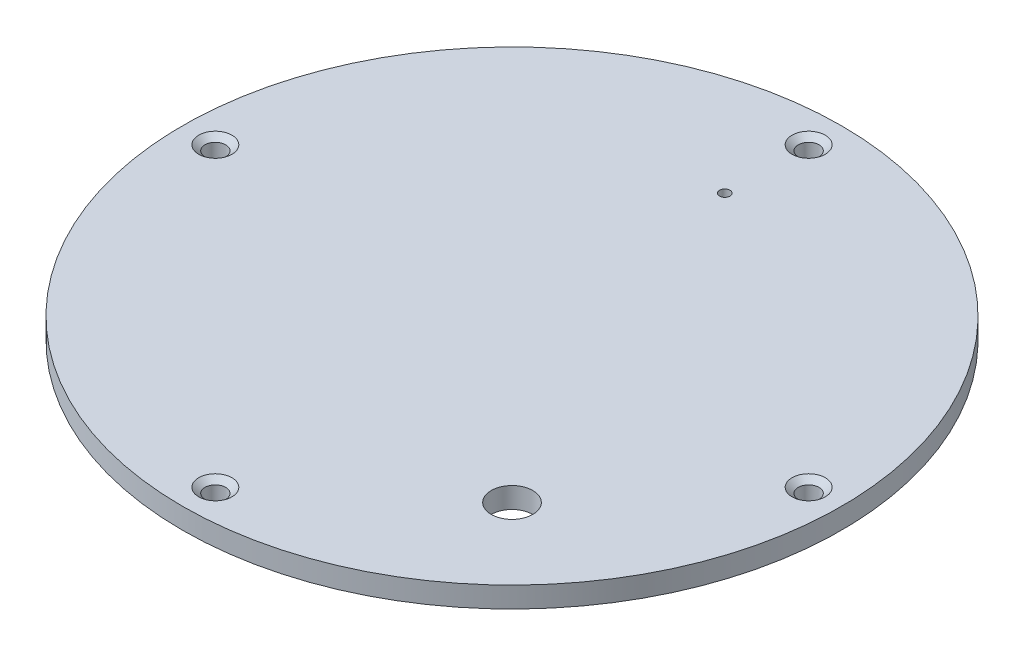
ISO-10303-21;
HEADER;
FILE_DESCRIPTION(('STEP AP214'),'2;1');
FILE_NAME('part.step','',(''),(''),'','','');
FILE_SCHEMA(('AUTOMOTIVE_DESIGN { 1 0 10303 214 1 1 1 1 }'));
ENDSEC;
DATA;
#1=APPLICATION_CONTEXT('core data for automotive mechanical design processes');
#2=APPLICATION_PROTOCOL_DEFINITION('international standard','automotive_design',2000,#1);
#3=PRODUCT_CONTEXT('',#1,'mechanical');
#4=PRODUCT('Part','Part','',(#3));
#5=PRODUCT_RELATED_PRODUCT_CATEGORY('part','',(#4));
#6=PRODUCT_DEFINITION_FORMATION('','',#4);
#7=PRODUCT_DEFINITION_CONTEXT('part definition',#1,'design');
#8=PRODUCT_DEFINITION('design','',#6,#7);
#9=PRODUCT_DEFINITION_SHAPE('','',#8);
#10=(LENGTH_UNIT() NAMED_UNIT(*) SI_UNIT(.MILLI.,.METRE.));
#11=(NAMED_UNIT(*) PLANE_ANGLE_UNIT() SI_UNIT($,.RADIAN.));
#12=(NAMED_UNIT(*) SI_UNIT($,.STERADIAN.) SOLID_ANGLE_UNIT());
#13=UNCERTAINTY_MEASURE_WITH_UNIT(LENGTH_MEASURE(1.E-05),#10,'distance_accuracy_value','');
#14=(GEOMETRIC_REPRESENTATION_CONTEXT(3) GLOBAL_UNCERTAINTY_ASSIGNED_CONTEXT((#13)) GLOBAL_UNIT_ASSIGNED_CONTEXT((#10,
#11,#12)) REPRESENTATION_CONTEXT('',''));
#15=CARTESIAN_POINT('',(0.,0.,0.));
#16=DIRECTION('',(0.,0.,1.));
#17=DIRECTION('',(1.,0.,0.));
#18=AXIS2_PLACEMENT_3D('',#15,#16,#17);
#19=CARTESIAN_POINT('',(0.,1.,0.));
#20=DIRECTION('',(0.,-1.,0.));
#21=DIRECTION('',(0.,0.,-1.));
#22=AXIS2_PLACEMENT_3D('',#19,#20,#21);
#23=CYLINDRICAL_SURFACE('',#22,15.875);
#24=CARTESIAN_POINT('',(0.,1.,0.));
#25=DIRECTION('',(0.,1.,0.));
#26=DIRECTION('',(0.,0.,1.));
#27=AXIS2_PLACEMENT_3D('',#24,#25,#26);
#28=CIRCLE('',#27,15.875);
#29=CARTESIAN_POINT('',(0.,1.,15.875));
#30=VERTEX_POINT('',#29);
#31=EDGE_CURVE('E10',#30,#30,#28,.T.);
#32=ORIENTED_EDGE('',*,*,#31,.F.);
#33=EDGE_LOOP('',(#32));
#34=FACE_BOUND('',#33,.T.);
#35=CARTESIAN_POINT('',(0.,0.,0.));
#36=DIRECTION('',(0.,1.,0.));
#37=DIRECTION('',(0.,0.,1.));
#38=AXIS2_PLACEMENT_3D('',#35,#36,#37);
#39=CIRCLE('',#38,15.875);
#40=CARTESIAN_POINT('',(0.,0.,15.875));
#41=VERTEX_POINT('',#40);
#42=EDGE_CURVE('E38',#41,#41,#39,.T.);
#43=ORIENTED_EDGE('',*,*,#42,.T.);
#44=EDGE_LOOP('',(#43));
#45=FACE_BOUND('',#44,.T.);
#46=ADVANCED_FACE('F31',(#34,#45),#23,.T.);
#47=CARTESIAN_POINT('',(0.,1.,0.));
#48=DIRECTION('',(0.,1.,0.));
#49=DIRECTION('',(0.,0.,1.));
#50=AXIS2_PLACEMENT_3D('',#47,#48,#49);
#51=PLANE('',#50);
#52=CARTESIAN_POINT('',(7.77817459305201,1.,7.77817459305204));
#53=DIRECTION('',(0.,-1.,0.));
#54=DIRECTION('',(0.,0.,-1.));
#55=AXIS2_PLACEMENT_3D('',#52,#53,#54);
#56=CIRCLE('',#55,1.00000000000001);
#57=CARTESIAN_POINT('',(7.77817459305201,1.,6.77817459305203));
#58=VERTEX_POINT('',#57);
#59=EDGE_CURVE('E86',#58,#58,#56,.T.);
#60=ORIENTED_EDGE('',*,*,#59,.T.);
#61=EDGE_LOOP('',(#60));
#62=FACE_BOUND('',#61,.T.);
#63=CARTESIAN_POINT('',(0.,1.,-10.25));
#64=DIRECTION('',(0.,1.,0.));
#65=DIRECTION('',(0.,0.,1.));
#66=AXIS2_PLACEMENT_3D('',#63,#64,#65);
#67=CIRCLE('',#66,0.25);
#68=CARTESIAN_POINT('',(0.,1.,-10.));
#69=VERTEX_POINT('',#68);
#70=EDGE_CURVE('E80',#69,#69,#67,.T.);
#71=ORIENTED_EDGE('',*,*,#70,.F.);
#72=EDGE_LOOP('',(#71));
#73=FACE_BOUND('',#72,.T.);
#74=CARTESIAN_POINT('',(0.,1.,-14.29));
#75=DIRECTION('',(0.,1.,0.));
#76=DIRECTION('',(0.,0.,1.));
#77=AXIS2_PLACEMENT_3D('',#74,#75,#76);
#78=CIRCLE('',#77,0.8);
#79=CARTESIAN_POINT('',(0.,1.,-13.49));
#80=VERTEX_POINT('',#79);
#81=EDGE_CURVE('E77',#80,#80,#78,.T.);
#82=ORIENTED_EDGE('',*,*,#81,.F.);
#83=EDGE_LOOP('',(#82));
#84=FACE_BOUND('',#83,.T.);
#85=CARTESIAN_POINT('',(14.29,1.,0.));
#86=DIRECTION('',(0.,1.,0.));
#87=DIRECTION('',(0.,0.,1.));
#88=AXIS2_PLACEMENT_3D('',#85,#86,#87);
#89=CIRCLE('',#88,0.8);
#90=CARTESIAN_POINT('',(14.29,1.,0.8));
#91=VERTEX_POINT('',#90);
#92=EDGE_CURVE('E68',#91,#91,#89,.T.);
#93=ORIENTED_EDGE('',*,*,#92,.F.);
#94=EDGE_LOOP('',(#93));
#95=FACE_BOUND('',#94,.T.);
#96=CARTESIAN_POINT('',(0.,1.,14.29));
#97=DIRECTION('',(0.,1.,0.));
#98=DIRECTION('',(0.,0.,1.));
#99=AXIS2_PLACEMENT_3D('',#96,#97,#98);
#100=CIRCLE('',#99,0.8);
#101=CARTESIAN_POINT('',(0.,1.,15.09));
#102=VERTEX_POINT('',#101);
#103=EDGE_CURVE('E59',#102,#102,#100,.T.);
#104=ORIENTED_EDGE('',*,*,#103,.F.);
#105=EDGE_LOOP('',(#104));
#106=FACE_BOUND('',#105,.T.);
#107=CARTESIAN_POINT('',(-14.29,1.,0.));
#108=DIRECTION('',(0.,1.,0.));
#109=DIRECTION('',(0.,0.,1.));
#110=AXIS2_PLACEMENT_3D('',#107,#108,#109);
#111=CIRCLE('',#110,0.8);
#112=CARTESIAN_POINT('',(-14.29,1.,0.8));
#113=VERTEX_POINT('',#112);
#114=EDGE_CURVE('E50',#113,#113,#111,.T.);
#115=ORIENTED_EDGE('',*,*,#114,.F.);
#116=EDGE_LOOP('',(#115));
#117=FACE_BOUND('',#116,.T.);
#118=ORIENTED_EDGE('',*,*,#31,.T.);
#119=EDGE_LOOP('',(#118));
#120=FACE_BOUND('',#119,.T.);
#121=ADVANCED_FACE('F108',(#62,#73,#84,#95,#106,#117,#120),#51,.T.);
#122=CARTESIAN_POINT('',(0.,0.,0.));
#123=DIRECTION('',(0.,1.,0.));
#124=DIRECTION('',(0.,0.,1.));
#125=AXIS2_PLACEMENT_3D('',#122,#123,#124);
#126=PLANE('',#125);
#127=CARTESIAN_POINT('',(7.77817459305201,0.,7.77817459305204));
#128=DIRECTION('',(0.,1.,0.));
#129=DIRECTION('',(0.,0.,1.));
#130=AXIS2_PLACEMENT_3D('',#127,#128,#129);
#131=CIRCLE('',#130,1.00000000000001);
#132=CARTESIAN_POINT('',(7.77817459305201,0.,8.77817459305204));
#133=VERTEX_POINT('',#132);
#134=EDGE_CURVE('E34',#133,#133,#131,.T.);
#135=ORIENTED_EDGE('',*,*,#134,.T.);
#136=EDGE_LOOP('',(#135));
#137=FACE_BOUND('',#136,.T.);
#138=CARTESIAN_POINT('',(0.,0.,-10.25));
#139=DIRECTION('',(0.,1.,0.));
#140=DIRECTION('',(0.,0.,1.));
#141=AXIS2_PLACEMENT_3D('',#138,#139,#140);
#142=CIRCLE('',#141,0.25);
#143=CARTESIAN_POINT('',(0.,0.,-10.));
#144=VERTEX_POINT('',#143);
#145=EDGE_CURVE('E83',#144,#144,#142,.T.);
#146=ORIENTED_EDGE('',*,*,#145,.T.);
#147=EDGE_LOOP('',(#146));
#148=FACE_BOUND('',#147,.T.);
#149=CARTESIAN_POINT('',(0.,0.,-14.29));
#150=DIRECTION('',(0.,1.,0.));
#151=DIRECTION('',(0.,0.,1.));
#152=AXIS2_PLACEMENT_3D('',#149,#150,#151);
#153=CIRCLE('',#152,0.499999999999988);
#154=CARTESIAN_POINT('',(0.,0.,-13.79));
#155=VERTEX_POINT('',#154);
#156=EDGE_CURVE('E71',#155,#155,#153,.T.);
#157=ORIENTED_EDGE('',*,*,#156,.T.);
#158=EDGE_LOOP('',(#157));
#159=FACE_BOUND('',#158,.T.);
#160=CARTESIAN_POINT('',(14.29,0.,0.));
#161=DIRECTION('',(0.,1.,0.));
#162=DIRECTION('',(0.,0.,1.));
#163=AXIS2_PLACEMENT_3D('',#160,#161,#162);
#164=CIRCLE('',#163,0.499999999999988);
#165=CARTESIAN_POINT('',(14.29,0.,0.499999999999988));
#166=VERTEX_POINT('',#165);
#167=EDGE_CURVE('E62',#166,#166,#164,.T.);
#168=ORIENTED_EDGE('',*,*,#167,.T.);
#169=EDGE_LOOP('',(#168));
#170=FACE_BOUND('',#169,.T.);
#171=CARTESIAN_POINT('',(0.,0.,14.29));
#172=DIRECTION('',(0.,1.,0.));
#173=DIRECTION('',(0.,0.,1.));
#174=AXIS2_PLACEMENT_3D('',#171,#172,#173);
#175=CIRCLE('',#174,0.499999999999988);
#176=CARTESIAN_POINT('',(0.,0.,14.79));
#177=VERTEX_POINT('',#176);
#178=EDGE_CURVE('E53',#177,#177,#175,.T.);
#179=ORIENTED_EDGE('',*,*,#178,.T.);
#180=EDGE_LOOP('',(#179));
#181=FACE_BOUND('',#180,.T.);
#182=CARTESIAN_POINT('',(-14.29,0.,0.));
#183=DIRECTION('',(0.,1.,0.));
#184=DIRECTION('',(0.,0.,1.));
#185=AXIS2_PLACEMENT_3D('',#182,#183,#184);
#186=CIRCLE('',#185,0.499999999999988);
#187=CARTESIAN_POINT('',(-14.29,0.,0.499999999999988));
#188=VERTEX_POINT('',#187);
#189=EDGE_CURVE('E43',#188,#188,#186,.T.);
#190=ORIENTED_EDGE('',*,*,#189,.T.);
#191=EDGE_LOOP('',(#190));
#192=FACE_BOUND('',#191,.T.);
#193=ORIENTED_EDGE('',*,*,#42,.F.);
#194=EDGE_LOOP('',(#193));
#195=FACE_BOUND('',#194,.T.);
#196=ADVANCED_FACE('F93',(#137,#148,#159,#170,#181,#192,#195),#126,.F.);
#197=CARTESIAN_POINT('',(-14.29,1.,0.));
#198=DIRECTION('',(0.,1.,0.));
#199=DIRECTION('',(0.,0.,1.));
#200=AXIS2_PLACEMENT_3D('',#197,#198,#199);
#201=CYLINDRICAL_SURFACE('',#200,0.499999999999988);
#202=ORIENTED_EDGE('',*,*,#189,.F.);
#203=EDGE_LOOP('',(#202));
#204=FACE_BOUND('',#203,.T.);
#205=CARTESIAN_POINT('',(-14.29,0.748270110646819,0.));
#206=DIRECTION('',(0.,1.,0.));
#207=DIRECTION('',(0.,0.,1.));
#208=AXIS2_PLACEMENT_3D('',#205,#206,#207);
#209=CIRCLE('',#208,0.499999999999988);
#210=CARTESIAN_POINT('',(-14.29,0.748270110646819,0.499999999999988));
#211=VERTEX_POINT('',#210);
#212=EDGE_CURVE('E47',#211,#211,#209,.T.);
#213=ORIENTED_EDGE('',*,*,#212,.T.);
#214=EDGE_LOOP('',(#213));
#215=FACE_BOUND('',#214,.T.);
#216=ADVANCED_FACE('F118',(#204,#215),#201,.F.);
#217=CARTESIAN_POINT('',(-14.29,1.,0.));
#218=DIRECTION('',(0.,1.,0.));
#219=DIRECTION('',(0.,0.,1.));
#220=AXIS2_PLACEMENT_3D('',#217,#218,#219);
#221=CONICAL_SURFACE('',#220,0.8,0.872664625997188);
#222=ORIENTED_EDGE('',*,*,#212,.F.);
#223=EDGE_LOOP('',(#222));
#224=FACE_BOUND('',#223,.T.);
#225=ORIENTED_EDGE('',*,*,#114,.T.);
#226=EDGE_LOOP('',(#225));
#227=FACE_BOUND('',#226,.T.);
#228=ADVANCED_FACE('F122',(#224,#227),#221,.F.);
#229=CARTESIAN_POINT('',(0.,1.,14.29));
#230=DIRECTION('',(0.,1.,0.));
#231=DIRECTION('',(0.,0.,1.));
#232=AXIS2_PLACEMENT_3D('',#229,#230,#231);
#233=CYLINDRICAL_SURFACE('',#232,0.499999999999988);
#234=ORIENTED_EDGE('',*,*,#178,.F.);
#235=EDGE_LOOP('',(#234));
#236=FACE_BOUND('',#235,.T.);
#237=CARTESIAN_POINT('',(0.,0.748270110646819,14.29));
#238=DIRECTION('',(0.,1.,0.));
#239=DIRECTION('',(0.,0.,1.));
#240=AXIS2_PLACEMENT_3D('',#237,#238,#239);
#241=CIRCLE('',#240,0.499999999999988);
#242=CARTESIAN_POINT('',(0.,0.748270110646819,14.79));
#243=VERTEX_POINT('',#242);
#244=EDGE_CURVE('E56',#243,#243,#241,.T.);
#245=ORIENTED_EDGE('',*,*,#244,.T.);
#246=EDGE_LOOP('',(#245));
#247=FACE_BOUND('',#246,.T.);
#248=ADVANCED_FACE('F128',(#236,#247),#233,.F.);
#249=CARTESIAN_POINT('',(0.,1.,14.29));
#250=DIRECTION('',(0.,1.,0.));
#251=DIRECTION('',(0.,0.,1.));
#252=AXIS2_PLACEMENT_3D('',#249,#250,#251);
#253=CONICAL_SURFACE('',#252,0.8,0.872664625997188);
#254=ORIENTED_EDGE('',*,*,#244,.F.);
#255=EDGE_LOOP('',(#254));
#256=FACE_BOUND('',#255,.T.);
#257=ORIENTED_EDGE('',*,*,#103,.T.);
#258=EDGE_LOOP('',(#257));
#259=FACE_BOUND('',#258,.T.);
#260=ADVANCED_FACE('F132',(#256,#259),#253,.F.);
#261=CARTESIAN_POINT('',(14.29,1.,0.));
#262=DIRECTION('',(0.,1.,0.));
#263=DIRECTION('',(0.,0.,1.));
#264=AXIS2_PLACEMENT_3D('',#261,#262,#263);
#265=CYLINDRICAL_SURFACE('',#264,0.499999999999988);
#266=ORIENTED_EDGE('',*,*,#167,.F.);
#267=EDGE_LOOP('',(#266));
#268=FACE_BOUND('',#267,.T.);
#269=CARTESIAN_POINT('',(14.29,0.748270110646819,0.));
#270=DIRECTION('',(0.,1.,0.));
#271=DIRECTION('',(0.,0.,1.));
#272=AXIS2_PLACEMENT_3D('',#269,#270,#271);
#273=CIRCLE('',#272,0.499999999999988);
#274=CARTESIAN_POINT('',(14.29,0.748270110646819,0.499999999999988));
#275=VERTEX_POINT('',#274);
#276=EDGE_CURVE('E65',#275,#275,#273,.T.);
#277=ORIENTED_EDGE('',*,*,#276,.T.);
#278=EDGE_LOOP('',(#277));
#279=FACE_BOUND('',#278,.T.);
#280=ADVANCED_FACE('F136',(#268,#279),#265,.F.);
#281=CARTESIAN_POINT('',(14.29,1.,0.));
#282=DIRECTION('',(0.,1.,0.));
#283=DIRECTION('',(0.,0.,1.));
#284=AXIS2_PLACEMENT_3D('',#281,#282,#283);
#285=CONICAL_SURFACE('',#284,0.8,0.872664625997188);
#286=ORIENTED_EDGE('',*,*,#276,.F.);
#287=EDGE_LOOP('',(#286));
#288=FACE_BOUND('',#287,.T.);
#289=ORIENTED_EDGE('',*,*,#92,.T.);
#290=EDGE_LOOP('',(#289));
#291=FACE_BOUND('',#290,.T.);
#292=ADVANCED_FACE('F140',(#288,#291),#285,.F.);
#293=CARTESIAN_POINT('',(0.,1.,-14.29));
#294=DIRECTION('',(0.,1.,0.));
#295=DIRECTION('',(0.,0.,1.));
#296=AXIS2_PLACEMENT_3D('',#293,#294,#295);
#297=CYLINDRICAL_SURFACE('',#296,0.499999999999988);
#298=ORIENTED_EDGE('',*,*,#156,.F.);
#299=EDGE_LOOP('',(#298));
#300=FACE_BOUND('',#299,.T.);
#301=CARTESIAN_POINT('',(0.,0.748270110646819,-14.29));
#302=DIRECTION('',(0.,1.,0.));
#303=DIRECTION('',(0.,0.,1.));
#304=AXIS2_PLACEMENT_3D('',#301,#302,#303);
#305=CIRCLE('',#304,0.499999999999988);
#306=CARTESIAN_POINT('',(0.,0.748270110646819,-13.79));
#307=VERTEX_POINT('',#306);
#308=EDGE_CURVE('E74',#307,#307,#305,.T.);
#309=ORIENTED_EDGE('',*,*,#308,.T.);
#310=EDGE_LOOP('',(#309));
#311=FACE_BOUND('',#310,.T.);
#312=ADVANCED_FACE('F144',(#300,#311),#297,.F.);
#313=CARTESIAN_POINT('',(0.,1.,-14.29));
#314=DIRECTION('',(0.,1.,0.));
#315=DIRECTION('',(0.,0.,1.));
#316=AXIS2_PLACEMENT_3D('',#313,#314,#315);
#317=CONICAL_SURFACE('',#316,0.8,0.872664625997188);
#318=ORIENTED_EDGE('',*,*,#308,.F.);
#319=EDGE_LOOP('',(#318));
#320=FACE_BOUND('',#319,.T.);
#321=ORIENTED_EDGE('',*,*,#81,.T.);
#322=EDGE_LOOP('',(#321));
#323=FACE_BOUND('',#322,.T.);
#324=ADVANCED_FACE('F104',(#320,#323),#317,.F.);
#325=CARTESIAN_POINT('',(0.,0.,-10.25));
#326=DIRECTION('',(0.,1.,0.));
#327=DIRECTION('',(0.,0.,1.));
#328=AXIS2_PLACEMENT_3D('',#325,#326,#327);
#329=CYLINDRICAL_SURFACE('',#328,0.25);
#330=ORIENTED_EDGE('',*,*,#70,.T.);
#331=EDGE_LOOP('',(#330));
#332=FACE_BOUND('',#331,.T.);
#333=ORIENTED_EDGE('',*,*,#145,.F.);
#334=EDGE_LOOP('',(#333));
#335=FACE_BOUND('',#334,.T.);
#336=ADVANCED_FACE('F98',(#332,#335),#329,.F.);
#337=CARTESIAN_POINT('',(7.77817459305201,1.,7.77817459305204));
#338=DIRECTION('',(0.,-1.,0.));
#339=DIRECTION('',(0.,0.,-1.));
#340=AXIS2_PLACEMENT_3D('',#337,#338,#339);
#341=CYLINDRICAL_SURFACE('',#340,1.00000000000001);
#342=ORIENTED_EDGE('',*,*,#59,.F.);
#343=EDGE_LOOP('',(#342));
#344=FACE_BOUND('',#343,.T.);
#345=ORIENTED_EDGE('',*,*,#134,.F.);
#346=EDGE_LOOP('',(#345));
#347=FACE_BOUND('',#346,.T.);
#348=ADVANCED_FACE('F96',(#344,#347),#341,.F.);
#349=CLOSED_SHELL('',(#46,#121,#196,#216,#228,#248,#260,#280,#292,#312,#324,#336,#348));
#350=MANIFOLD_SOLID_BREP('B2',#349);
#351=ADVANCED_BREP_SHAPE_REPRESENTATION('',(#18,#350),#14);
#352=SHAPE_DEFINITION_REPRESENTATION(#9,#351);
ENDSEC;
END-ISO-10303-21;
